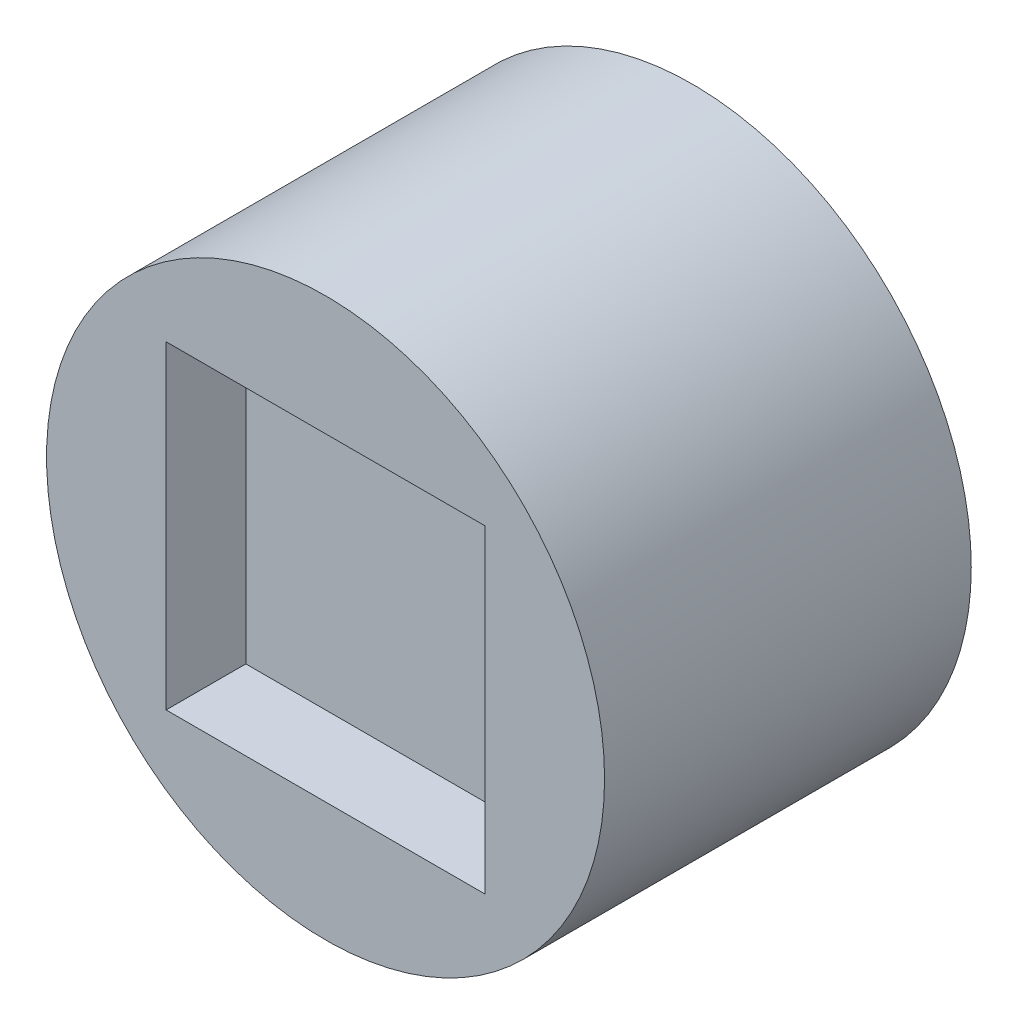
ISO-10303-21;
HEADER;
FILE_DESCRIPTION(('STEP AP214'),'2;1');
FILE_NAME('part.step','',(''),(''),'','','');
FILE_SCHEMA(('AUTOMOTIVE_DESIGN { 1 0 10303 214 1 1 1 1 }'));
ENDSEC;
DATA;
#1=APPLICATION_CONTEXT('core data for automotive mechanical design processes');
#2=APPLICATION_PROTOCOL_DEFINITION('international standard','automotive_design',2000,#1);
#3=PRODUCT_CONTEXT('',#1,'mechanical');
#4=PRODUCT('Part','Part','',(#3));
#5=PRODUCT_RELATED_PRODUCT_CATEGORY('part','',(#4));
#6=PRODUCT_DEFINITION_FORMATION('','',#4);
#7=PRODUCT_DEFINITION_CONTEXT('part definition',#1,'design');
#8=PRODUCT_DEFINITION('design','',#6,#7);
#9=PRODUCT_DEFINITION_SHAPE('','',#8);
#10=(LENGTH_UNIT() NAMED_UNIT(*) SI_UNIT(.MILLI.,.METRE.));
#11=(NAMED_UNIT(*) PLANE_ANGLE_UNIT() SI_UNIT($,.RADIAN.));
#12=(NAMED_UNIT(*) SI_UNIT($,.STERADIAN.) SOLID_ANGLE_UNIT());
#13=UNCERTAINTY_MEASURE_WITH_UNIT(LENGTH_MEASURE(1.E-05),#10,'distance_accuracy_value','');
#14=(GEOMETRIC_REPRESENTATION_CONTEXT(3) GLOBAL_UNCERTAINTY_ASSIGNED_CONTEXT((#13)) GLOBAL_UNIT_ASSIGNED_CONTEXT((#10,
#11,#12)) REPRESENTATION_CONTEXT('',''));
#15=CARTESIAN_POINT('',(0.,0.,0.));
#16=DIRECTION('',(0.,0.,1.));
#17=DIRECTION('',(1.,0.,0.));
#18=AXIS2_PLACEMENT_3D('',#15,#16,#17);
#19=CARTESIAN_POINT('',(0.,0.,0.23));
#20=DIRECTION('',(0.,0.,-1.));
#21=DIRECTION('',(-1.,0.,0.));
#22=AXIS2_PLACEMENT_3D('',#19,#20,#21);
#23=CYLINDRICAL_SURFACE('',#22,0.175);
#24=CARTESIAN_POINT('',(0.,0.,0.23));
#25=DIRECTION('',(0.,0.,1.));
#26=DIRECTION('',(1.,0.,0.));
#27=AXIS2_PLACEMENT_3D('',#24,#25,#26);
#28=CIRCLE('',#27,0.175);
#29=CARTESIAN_POINT('',(0.175,0.,0.23));
#30=VERTEX_POINT('',#29);
#31=EDGE_CURVE('E11',#30,#30,#28,.T.);
#32=ORIENTED_EDGE('',*,*,#31,.F.);
#33=EDGE_LOOP('',(#32));
#34=FACE_BOUND('',#33,.T.);
#35=CARTESIAN_POINT('',(0.,0.,0.));
#36=DIRECTION('',(0.,0.,1.));
#37=DIRECTION('',(1.,0.,0.));
#38=AXIS2_PLACEMENT_3D('',#35,#36,#37);
#39=CIRCLE('',#38,0.175);
#40=CARTESIAN_POINT('',(0.175,0.,0.));
#41=VERTEX_POINT('',#40);
#42=EDGE_CURVE('E42',#41,#41,#39,.T.);
#43=ORIENTED_EDGE('',*,*,#42,.T.);
#44=EDGE_LOOP('',(#43));
#45=FACE_BOUND('',#44,.T.);
#46=ADVANCED_FACE('F39',(#34,#45),#23,.T.);
#47=CARTESIAN_POINT('',(0.,0.,0.23));
#48=DIRECTION('',(0.,0.,1.));
#49=DIRECTION('',(1.,0.,0.));
#50=AXIS2_PLACEMENT_3D('',#47,#48,#49);
#51=PLANE('',#50);
#52=DIRECTION('',(0.,-1.,0.));
#53=VECTOR('',#52,1.);
#54=CARTESIAN_POINT('',(-0.1,0.1,0.23));
#55=LINE('',#54,#53);
#56=CARTESIAN_POINT('',(-0.1,0.1,0.23));
#57=VERTEX_POINT('',#56);
#58=CARTESIAN_POINT('',(-0.1,-0.1,0.23));
#59=VERTEX_POINT('',#58);
#60=EDGE_CURVE('E62',#57,#59,#55,.T.);
#61=ORIENTED_EDGE('',*,*,#60,.F.);
#62=DIRECTION('',(-1.,0.,0.));
#63=VECTOR('',#62,1.);
#64=CARTESIAN_POINT('',(-0.1,0.1,0.23));
#65=LINE('',#64,#63);
#66=CARTESIAN_POINT('',(0.1,0.1,0.23));
#67=VERTEX_POINT('',#66);
#68=EDGE_CURVE('E159',#67,#57,#65,.T.);
#69=ORIENTED_EDGE('',*,*,#68,.F.);
#70=DIRECTION('',(0.,1.,0.));
#71=VECTOR('',#70,1.);
#72=CARTESIAN_POINT('',(0.1,0.1,0.23));
#73=LINE('',#72,#71);
#74=CARTESIAN_POINT('',(0.1,-0.1,0.23));
#75=VERTEX_POINT('',#74);
#76=EDGE_CURVE('E178',#75,#67,#73,.T.);
#77=ORIENTED_EDGE('',*,*,#76,.F.);
#78=DIRECTION('',(1.,0.,0.));
#79=VECTOR('',#78,1.);
#80=CARTESIAN_POINT('',(-0.1,-0.1,0.23));
#81=LINE('',#80,#79);
#82=EDGE_CURVE('E174',#59,#75,#81,.T.);
#83=ORIENTED_EDGE('',*,*,#82,.F.);
#84=EDGE_LOOP('',(#61,#69,#77,#83));
#85=FACE_BOUND('',#84,.T.);
#86=ORIENTED_EDGE('',*,*,#31,.T.);
#87=EDGE_LOOP('',(#86));
#88=FACE_BOUND('',#87,.T.);
#89=ADVANCED_FACE('F202',(#85,#88),#51,.T.);
#90=CARTESIAN_POINT('',(0.,0.,0.));
#91=DIRECTION('',(0.,0.,1.));
#92=DIRECTION('',(1.,0.,0.));
#93=AXIS2_PLACEMENT_3D('',#90,#91,#92);
#94=PLANE('',#93);
#95=DIRECTION('',(-1.,0.,0.));
#96=VECTOR('',#95,1.);
#97=CARTESIAN_POINT('',(0.1,-0.1,0.));
#98=LINE('',#97,#96);
#99=CARTESIAN_POINT('',(0.1,-0.1,0.));
#100=VERTEX_POINT('',#99);
#101=CARTESIAN_POINT('',(-0.1,-0.1,0.));
#102=VERTEX_POINT('',#101);
#103=EDGE_CURVE('E140',#100,#102,#98,.T.);
#104=ORIENTED_EDGE('',*,*,#103,.F.);
#105=DIRECTION('',(0.,-1.,0.));
#106=VECTOR('',#105,1.);
#107=CARTESIAN_POINT('',(0.1,0.1,0.));
#108=LINE('',#107,#106);
#109=CARTESIAN_POINT('',(0.1,0.1,0.));
#110=VERTEX_POINT('',#109);
#111=EDGE_CURVE('E54',#110,#100,#108,.T.);
#112=ORIENTED_EDGE('',*,*,#111,.F.);
#113=DIRECTION('',(1.,0.,0.));
#114=VECTOR('',#113,1.);
#115=CARTESIAN_POINT('',(0.1,0.1,0.));
#116=LINE('',#115,#114);
#117=CARTESIAN_POINT('',(-0.1,0.1,0.));
#118=VERTEX_POINT('',#117);
#119=EDGE_CURVE('E127',#118,#110,#116,.T.);
#120=ORIENTED_EDGE('',*,*,#119,.F.);
#121=DIRECTION('',(0.,1.,0.));
#122=VECTOR('',#121,1.);
#123=CARTESIAN_POINT('',(-0.1,0.1,0.));
#124=LINE('',#123,#122);
#125=EDGE_CURVE('E131',#102,#118,#124,.T.);
#126=ORIENTED_EDGE('',*,*,#125,.F.);
#127=EDGE_LOOP('',(#104,#112,#120,#126));
#128=FACE_BOUND('',#127,.T.);
#129=ORIENTED_EDGE('',*,*,#42,.F.);
#130=EDGE_LOOP('',(#129));
#131=FACE_BOUND('',#130,.T.);
#132=ADVANCED_FACE('F221',(#128,#131),#94,.F.);
#133=CARTESIAN_POINT('',(-0.1,0.1,0.18));
#134=DIRECTION('',(-1.,0.,0.));
#135=DIRECTION('',(0.,0.,1.));
#136=AXIS2_PLACEMENT_3D('',#133,#134,#135);
#137=PLANE('',#136);
#138=ORIENTED_EDGE('',*,*,#60,.T.);
#139=DIRECTION('',(0.,0.,1.));
#140=VECTOR('',#139,1.);
#141=CARTESIAN_POINT('',(-0.1,-0.1,0.18));
#142=LINE('',#141,#140);
#143=CARTESIAN_POINT('',(-0.1,-0.1,0.18));
#144=VERTEX_POINT('',#143);
#145=EDGE_CURVE('E171',#144,#59,#142,.T.);
#146=ORIENTED_EDGE('',*,*,#145,.F.);
#147=DIRECTION('',(0.,-1.,0.));
#148=VECTOR('',#147,1.);
#149=CARTESIAN_POINT('',(-0.1,0.1,0.18));
#150=LINE('',#149,#148);
#151=CARTESIAN_POINT('',(-0.1,0.1,0.18));
#152=VERTEX_POINT('',#151);
#153=EDGE_CURVE('E154',#152,#144,#150,.T.);
#154=ORIENTED_EDGE('',*,*,#153,.F.);
#155=DIRECTION('',(0.,0.,1.));
#156=VECTOR('',#155,1.);
#157=CARTESIAN_POINT('',(-0.1,0.1,0.18));
#158=LINE('',#157,#156);
#159=EDGE_CURVE('E185',#152,#57,#158,.T.);
#160=ORIENTED_EDGE('',*,*,#159,.T.);
#161=EDGE_LOOP('',(#138,#146,#154,#160));
#162=FACE_BOUND('',#161,.T.);
#163=ADVANCED_FACE('F211',(#162),#137,.F.);
#164=CARTESIAN_POINT('',(-0.1,0.1,0.18));
#165=DIRECTION('',(0.,1.,0.));
#166=DIRECTION('',(0.,0.,1.));
#167=AXIS2_PLACEMENT_3D('',#164,#165,#166);
#168=PLANE('',#167);
#169=ORIENTED_EDGE('',*,*,#68,.T.);
#170=ORIENTED_EDGE('',*,*,#159,.F.);
#171=DIRECTION('',(-1.,0.,0.));
#172=VECTOR('',#171,1.);
#173=CARTESIAN_POINT('',(-0.1,0.1,0.18));
#174=LINE('',#173,#172);
#175=CARTESIAN_POINT('',(0.1,0.1,0.18));
#176=VERTEX_POINT('',#175);
#177=EDGE_CURVE('E167',#176,#152,#174,.T.);
#178=ORIENTED_EDGE('',*,*,#177,.F.);
#179=DIRECTION('',(0.,0.,1.));
#180=VECTOR('',#179,1.);
#181=CARTESIAN_POINT('',(0.1,0.1,0.18));
#182=LINE('',#181,#180);
#183=EDGE_CURVE('E188',#176,#67,#182,.T.);
#184=ORIENTED_EDGE('',*,*,#183,.T.);
#185=EDGE_LOOP('',(#169,#170,#178,#184));
#186=FACE_BOUND('',#185,.T.);
#187=ADVANCED_FACE('F213',(#186),#168,.F.);
#188=CARTESIAN_POINT('',(0.1,0.1,0.18));
#189=DIRECTION('',(1.,0.,0.));
#190=DIRECTION('',(0.,1.,0.));
#191=AXIS2_PLACEMENT_3D('',#188,#189,#190);
#192=PLANE('',#191);
#193=ORIENTED_EDGE('',*,*,#76,.T.);
#194=ORIENTED_EDGE('',*,*,#183,.F.);
#195=DIRECTION('',(0.,1.,0.));
#196=VECTOR('',#195,1.);
#197=CARTESIAN_POINT('',(0.1,0.1,0.18));
#198=LINE('',#197,#196);
#199=CARTESIAN_POINT('',(0.1,-0.1,0.18));
#200=VERTEX_POINT('',#199);
#201=EDGE_CURVE('E163',#200,#176,#198,.T.);
#202=ORIENTED_EDGE('',*,*,#201,.F.);
#203=DIRECTION('',(0.,0.,1.));
#204=VECTOR('',#203,1.);
#205=CARTESIAN_POINT('',(0.1,-0.1,0.18));
#206=LINE('',#205,#204);
#207=EDGE_CURVE('E191',#200,#75,#206,.T.);
#208=ORIENTED_EDGE('',*,*,#207,.T.);
#209=EDGE_LOOP('',(#193,#194,#202,#208));
#210=FACE_BOUND('',#209,.T.);
#211=ADVANCED_FACE('F206',(#210),#192,.F.);
#212=CARTESIAN_POINT('',(-0.1,-0.1,0.18));
#213=DIRECTION('',(0.,-1.,0.));
#214=DIRECTION('',(0.,0.,-1.));
#215=AXIS2_PLACEMENT_3D('',#212,#213,#214);
#216=PLANE('',#215);
#217=ORIENTED_EDGE('',*,*,#82,.T.);
#218=ORIENTED_EDGE('',*,*,#207,.F.);
#219=DIRECTION('',(1.,0.,0.));
#220=VECTOR('',#219,1.);
#221=CARTESIAN_POINT('',(-0.1,-0.1,0.18));
#222=LINE('',#221,#220);
#223=EDGE_CURVE('E158',#144,#200,#222,.T.);
#224=ORIENTED_EDGE('',*,*,#223,.F.);
#225=ORIENTED_EDGE('',*,*,#145,.T.);
#226=EDGE_LOOP('',(#217,#218,#224,#225));
#227=FACE_BOUND('',#226,.T.);
#228=ADVANCED_FACE('F198',(#227),#216,.F.);
#229=CARTESIAN_POINT('',(0.,0.,0.18));
#230=DIRECTION('',(0.,0.,1.));
#231=DIRECTION('',(1.,0.,0.));
#232=AXIS2_PLACEMENT_3D('',#229,#230,#231);
#233=PLANE('',#232);
#234=ORIENTED_EDGE('',*,*,#153,.T.);
#235=ORIENTED_EDGE('',*,*,#223,.T.);
#236=ORIENTED_EDGE('',*,*,#201,.T.);
#237=ORIENTED_EDGE('',*,*,#177,.T.);
#238=EDGE_LOOP('',(#234,#235,#236,#237));
#239=FACE_BOUND('',#238,.T.);
#240=ADVANCED_FACE('F210',(#239),#233,.T.);
#241=CARTESIAN_POINT('',(0.1,0.1,0.1));
#242=DIRECTION('',(1.,0.,0.));
#243=DIRECTION('',(0.,1.,0.));
#244=AXIS2_PLACEMENT_3D('',#241,#242,#243);
#245=PLANE('',#244);
#246=ORIENTED_EDGE('',*,*,#111,.T.);
#247=DIRECTION('',(0.,0.,-1.));
#248=VECTOR('',#247,1.);
#249=CARTESIAN_POINT('',(0.1,-0.1,0.1));
#250=LINE('',#249,#248);
#251=CARTESIAN_POINT('',(0.1,-0.1,0.1));
#252=VERTEX_POINT('',#251);
#253=EDGE_CURVE('E102',#252,#100,#250,.T.);
#254=ORIENTED_EDGE('',*,*,#253,.F.);
#255=DIRECTION('',(0.,-1.,0.));
#256=VECTOR('',#255,1.);
#257=CARTESIAN_POINT('',(0.1,0.1,0.1));
#258=LINE('',#257,#256);
#259=CARTESIAN_POINT('',(0.1,0.1,0.1));
#260=VERTEX_POINT('',#259);
#261=EDGE_CURVE('E106',#260,#252,#258,.T.);
#262=ORIENTED_EDGE('',*,*,#261,.F.);
#263=DIRECTION('',(0.,0.,-1.));
#264=VECTOR('',#263,1.);
#265=CARTESIAN_POINT('',(0.1,0.1,0.1));
#266=LINE('',#265,#264);
#267=EDGE_CURVE('E146',#260,#110,#266,.T.);
#268=ORIENTED_EDGE('',*,*,#267,.T.);
#269=EDGE_LOOP('',(#246,#254,#262,#268));
#270=FACE_BOUND('',#269,.T.);
#271=ADVANCED_FACE('F104',(#270),#245,.F.);
#272=CARTESIAN_POINT('',(0.1,0.1,0.1));
#273=DIRECTION('',(0.,1.,0.));
#274=DIRECTION('',(0.,0.,1.));
#275=AXIS2_PLACEMENT_3D('',#272,#273,#274);
#276=PLANE('',#275);
#277=ORIENTED_EDGE('',*,*,#119,.T.);
#278=ORIENTED_EDGE('',*,*,#267,.F.);
#279=DIRECTION('',(1.,0.,0.));
#280=VECTOR('',#279,1.);
#281=CARTESIAN_POINT('',(0.1,0.1,0.1));
#282=LINE('',#281,#280);
#283=CARTESIAN_POINT('',(-0.1,0.1,0.1));
#284=VERTEX_POINT('',#283);
#285=EDGE_CURVE('E113',#284,#260,#282,.T.);
#286=ORIENTED_EDGE('',*,*,#285,.F.);
#287=DIRECTION('',(0.,0.,-1.));
#288=VECTOR('',#287,1.);
#289=CARTESIAN_POINT('',(-0.1,0.1,0.1));
#290=LINE('',#289,#288);
#291=EDGE_CURVE('E149',#284,#118,#290,.T.);
#292=ORIENTED_EDGE('',*,*,#291,.T.);
#293=EDGE_LOOP('',(#277,#278,#286,#292));
#294=FACE_BOUND('',#293,.T.);
#295=ADVANCED_FACE('F248',(#294),#276,.F.);
#296=CARTESIAN_POINT('',(-0.1,0.1,0.1));
#297=DIRECTION('',(-1.,0.,0.));
#298=DIRECTION('',(0.,-1.,0.));
#299=AXIS2_PLACEMENT_3D('',#296,#297,#298);
#300=PLANE('',#299);
#301=ORIENTED_EDGE('',*,*,#125,.T.);
#302=ORIENTED_EDGE('',*,*,#291,.F.);
#303=DIRECTION('',(0.,1.,0.));
#304=VECTOR('',#303,1.);
#305=CARTESIAN_POINT('',(-0.1,0.1,0.1));
#306=LINE('',#305,#304);
#307=CARTESIAN_POINT('',(-0.1,-0.1,0.1));
#308=VERTEX_POINT('',#307);
#309=EDGE_CURVE('E122',#308,#284,#306,.T.);
#310=ORIENTED_EDGE('',*,*,#309,.F.);
#311=DIRECTION('',(0.,0.,-1.));
#312=VECTOR('',#311,1.);
#313=CARTESIAN_POINT('',(-0.1,-0.1,0.1));
#314=LINE('',#313,#312);
#315=EDGE_CURVE('E112',#308,#102,#314,.T.);
#316=ORIENTED_EDGE('',*,*,#315,.T.);
#317=EDGE_LOOP('',(#301,#302,#310,#316));
#318=FACE_BOUND('',#317,.T.);
#319=ADVANCED_FACE('F253',(#318),#300,.F.);
#320=CARTESIAN_POINT('',(0.1,-0.1,0.1));
#321=DIRECTION('',(0.,-1.,0.));
#322=DIRECTION('',(0.,0.,-1.));
#323=AXIS2_PLACEMENT_3D('',#320,#321,#322);
#324=PLANE('',#323);
#325=ORIENTED_EDGE('',*,*,#103,.T.);
#326=ORIENTED_EDGE('',*,*,#315,.F.);
#327=DIRECTION('',(-1.,0.,0.));
#328=VECTOR('',#327,1.);
#329=CARTESIAN_POINT('',(0.1,-0.1,0.1));
#330=LINE('',#329,#328);
#331=EDGE_CURVE('E116',#252,#308,#330,.T.);
#332=ORIENTED_EDGE('',*,*,#331,.F.);
#333=ORIENTED_EDGE('',*,*,#253,.T.);
#334=EDGE_LOOP('',(#325,#326,#332,#333));
#335=FACE_BOUND('',#334,.T.);
#336=ADVANCED_FACE('F117',(#335),#324,.F.);
#337=CARTESIAN_POINT('',(0.,0.,0.1));
#338=DIRECTION('',(0.,0.,-1.));
#339=DIRECTION('',(-1.,0.,0.));
#340=AXIS2_PLACEMENT_3D('',#337,#338,#339);
#341=PLANE('',#340);
#342=ORIENTED_EDGE('',*,*,#261,.T.);
#343=ORIENTED_EDGE('',*,*,#331,.T.);
#344=ORIENTED_EDGE('',*,*,#309,.T.);
#345=ORIENTED_EDGE('',*,*,#285,.T.);
#346=EDGE_LOOP('',(#342,#343,#344,#345));
#347=FACE_BOUND('',#346,.T.);
#348=ADVANCED_FACE('F124',(#347),#341,.T.);
#349=CLOSED_SHELL('',(#46,#89,#132,#163,#187,#211,#228,#240,#271,#295,#319,#336,#348));
#350=MANIFOLD_SOLID_BREP('B2',#349);
#351=ADVANCED_BREP_SHAPE_REPRESENTATION('',(#18,#350),#14);
#352=SHAPE_DEFINITION_REPRESENTATION(#9,#351);
ENDSEC;
END-ISO-10303-21;
